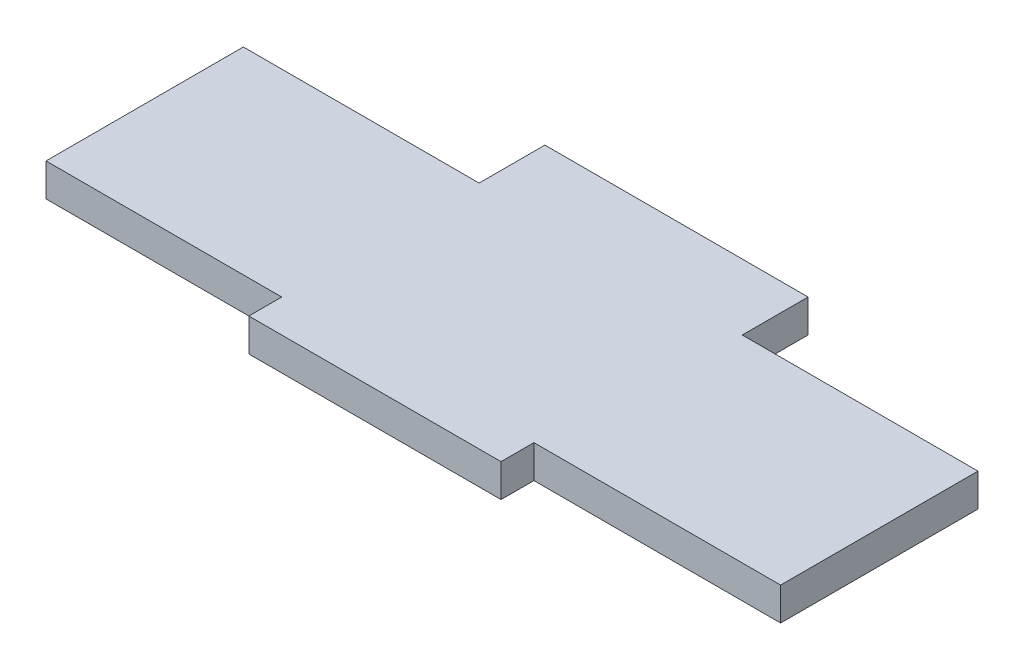
ISO-10303-21;
HEADER;
FILE_DESCRIPTION(('STEP AP214'),'2;1');
FILE_NAME('part.step','',(''),(''),'','','');
FILE_SCHEMA(('AUTOMOTIVE_DESIGN { 1 0 10303 214 1 1 1 1 }'));
ENDSEC;
DATA;
#1=APPLICATION_CONTEXT('core data for automotive mechanical design processes');
#2=APPLICATION_PROTOCOL_DEFINITION('international standard','automotive_design',2000,#1);
#3=PRODUCT_CONTEXT('',#1,'mechanical');
#4=PRODUCT('Part','Part','',(#3));
#5=PRODUCT_RELATED_PRODUCT_CATEGORY('part','',(#4));
#6=PRODUCT_DEFINITION_FORMATION('','',#4);
#7=PRODUCT_DEFINITION_CONTEXT('part definition',#1,'design');
#8=PRODUCT_DEFINITION('design','',#6,#7);
#9=PRODUCT_DEFINITION_SHAPE('','',#8);
#10=(LENGTH_UNIT() NAMED_UNIT(*) SI_UNIT(.MILLI.,.METRE.));
#11=(NAMED_UNIT(*) PLANE_ANGLE_UNIT() SI_UNIT($,.RADIAN.));
#12=(NAMED_UNIT(*) SI_UNIT($,.STERADIAN.) SOLID_ANGLE_UNIT());
#13=UNCERTAINTY_MEASURE_WITH_UNIT(LENGTH_MEASURE(1.E-05),#10,'distance_accuracy_value','');
#14=(GEOMETRIC_REPRESENTATION_CONTEXT(3) GLOBAL_UNCERTAINTY_ASSIGNED_CONTEXT((#13)) GLOBAL_UNIT_ASSIGNED_CONTEXT((#10,
#11,#12)) REPRESENTATION_CONTEXT('',''));
#15=CARTESIAN_POINT('',(0.,0.,0.));
#16=DIRECTION('',(0.,0.,1.));
#17=DIRECTION('',(1.,0.,0.));
#18=AXIS2_PLACEMENT_3D('',#15,#16,#17);
#19=CARTESIAN_POINT('',(-22.4972309435807,3.,0.));
#20=DIRECTION('',(1.,0.,0.));
#21=DIRECTION('',(0.,0.,-1.));
#22=AXIS2_PLACEMENT_3D('',#19,#20,#21);
#23=PLANE('',#22);
#24=DIRECTION('',(0.,0.,1.));
#25=VECTOR('',#24,1.);
#26=CARTESIAN_POINT('',(-22.4972309435807,0.,0.));
#27=LINE('',#26,#25);
#28=CARTESIAN_POINT('',(-22.4972309435807,0.,0.));
#29=VERTEX_POINT('',#28);
#30=CARTESIAN_POINT('',(-22.4972309435807,0.,3.));
#31=VERTEX_POINT('',#30);
#32=EDGE_CURVE('E155',#29,#31,#27,.T.);
#33=ORIENTED_EDGE('',*,*,#32,.F.);
#34=DIRECTION('',(0.,-1.,0.));
#35=VECTOR('',#34,1.);
#36=CARTESIAN_POINT('',(-22.4972309435807,3.,0.));
#37=LINE('',#36,#35);
#38=CARTESIAN_POINT('',(-22.4972309435807,3.,0.));
#39=VERTEX_POINT('',#38);
#40=EDGE_CURVE('E11',#39,#29,#37,.T.);
#41=ORIENTED_EDGE('',*,*,#40,.F.);
#42=DIRECTION('',(0.,0.,1.));
#43=VECTOR('',#42,1.);
#44=CARTESIAN_POINT('',(-22.4972309435807,3.,0.));
#45=LINE('',#44,#43);
#46=CARTESIAN_POINT('',(-22.4972309435807,3.,3.));
#47=VERTEX_POINT('',#46);
#48=EDGE_CURVE('E182',#39,#47,#45,.T.);
#49=ORIENTED_EDGE('',*,*,#48,.T.);
#50=DIRECTION('',(0.,-1.,0.));
#51=VECTOR('',#50,1.);
#52=CARTESIAN_POINT('',(-22.4972309435807,3.,3.));
#53=LINE('',#52,#51);
#54=EDGE_CURVE('E98',#47,#31,#53,.T.);
#55=ORIENTED_EDGE('',*,*,#54,.T.);
#56=EDGE_LOOP('',(#33,#41,#49,#55));
#57=FACE_BOUND('',#56,.T.);
#58=ADVANCED_FACE('F35',(#57),#23,.T.);
#59=CARTESIAN_POINT('',(0.,3.,0.));
#60=DIRECTION('',(0.,0.,-1.));
#61=DIRECTION('',(-1.,0.,0.));
#62=AXIS2_PLACEMENT_3D('',#59,#60,#61);
#63=PLANE('',#62);
#64=DIRECTION('',(1.,0.,0.));
#65=VECTOR('',#64,1.);
#66=CARTESIAN_POINT('',(0.,0.,0.));
#67=LINE('',#66,#65);
#68=CARTESIAN_POINT('',(0.,0.,0.));
#69=VERTEX_POINT('',#68);
#70=EDGE_CURVE('E158',#29,#69,#67,.T.);
#71=ORIENTED_EDGE('',*,*,#70,.T.);
#72=DIRECTION('',(0.,-1.,0.));
#73=VECTOR('',#72,1.);
#74=CARTESIAN_POINT('',(0.,3.,0.));
#75=LINE('',#74,#73);
#76=CARTESIAN_POINT('',(0.,3.,0.));
#77=VERTEX_POINT('',#76);
#78=EDGE_CURVE('E43',#77,#69,#75,.T.);
#79=ORIENTED_EDGE('',*,*,#78,.F.);
#80=DIRECTION('',(1.,0.,0.));
#81=VECTOR('',#80,1.);
#82=CARTESIAN_POINT('',(0.,3.,0.));
#83=LINE('',#82,#81);
#84=EDGE_CURVE('E141',#39,#77,#83,.T.);
#85=ORIENTED_EDGE('',*,*,#84,.F.);
#86=ORIENTED_EDGE('',*,*,#40,.T.);
#87=EDGE_LOOP('',(#71,#79,#85,#86));
#88=FACE_BOUND('',#87,.T.);
#89=ADVANCED_FACE('F206',(#88),#63,.F.);
#90=CARTESIAN_POINT('',(0.,3.,0.));
#91=DIRECTION('',(1.,0.,0.));
#92=DIRECTION('',(0.,0.,-1.));
#93=AXIS2_PLACEMENT_3D('',#90,#91,#92);
#94=PLANE('',#93);
#95=DIRECTION('',(0.,0.,1.));
#96=VECTOR('',#95,1.);
#97=CARTESIAN_POINT('',(0.,0.,0.));
#98=LINE('',#97,#96);
#99=CARTESIAN_POINT('',(0.,0.,-18.));
#100=VERTEX_POINT('',#99);
#101=EDGE_CURVE('E161',#100,#69,#98,.T.);
#102=ORIENTED_EDGE('',*,*,#101,.F.);
#103=DIRECTION('',(0.,-1.,0.));
#104=VECTOR('',#103,1.);
#105=CARTESIAN_POINT('',(0.,3.,-18.));
#106=LINE('',#105,#104);
#107=CARTESIAN_POINT('',(0.,3.,-18.));
#108=VERTEX_POINT('',#107);
#109=EDGE_CURVE('E196',#108,#100,#106,.T.);
#110=ORIENTED_EDGE('',*,*,#109,.F.);
#111=DIRECTION('',(0.,0.,1.));
#112=VECTOR('',#111,1.);
#113=CARTESIAN_POINT('',(0.,3.,0.));
#114=LINE('',#113,#112);
#115=EDGE_CURVE('E203',#108,#77,#114,.T.);
#116=ORIENTED_EDGE('',*,*,#115,.T.);
#117=ORIENTED_EDGE('',*,*,#78,.T.);
#118=EDGE_LOOP('',(#102,#110,#116,#117));
#119=FACE_BOUND('',#118,.T.);
#120=ADVANCED_FACE('F201',(#119),#94,.T.);
#121=CARTESIAN_POINT('',(0.,3.,-18.));
#122=DIRECTION('',(0.,0.,-1.));
#123=DIRECTION('',(-1.,0.,0.));
#124=AXIS2_PLACEMENT_3D('',#121,#122,#123);
#125=PLANE('',#124);
#126=DIRECTION('',(1.,0.,0.));
#127=VECTOR('',#126,1.);
#128=CARTESIAN_POINT('',(0.,0.,-18.));
#129=LINE('',#128,#127);
#130=CARTESIAN_POINT('',(-21.4972309435807,0.,-18.));
#131=VERTEX_POINT('',#130);
#132=EDGE_CURVE('E164',#131,#100,#129,.T.);
#133=ORIENTED_EDGE('',*,*,#132,.F.);
#134=DIRECTION('',(0.,-1.,0.));
#135=VECTOR('',#134,1.);
#136=CARTESIAN_POINT('',(-21.4972309435807,3.,-18.));
#137=LINE('',#136,#135);
#138=CARTESIAN_POINT('',(-21.4972309435807,3.,-18.));
#139=VERTEX_POINT('',#138);
#140=EDGE_CURVE('E194',#139,#131,#137,.T.);
#141=ORIENTED_EDGE('',*,*,#140,.F.);
#142=DIRECTION('',(1.,0.,0.));
#143=VECTOR('',#142,1.);
#144=CARTESIAN_POINT('',(0.,3.,-18.));
#145=LINE('',#144,#143);
#146=EDGE_CURVE('E216',#139,#108,#145,.T.);
#147=ORIENTED_EDGE('',*,*,#146,.T.);
#148=ORIENTED_EDGE('',*,*,#109,.T.);
#149=EDGE_LOOP('',(#133,#141,#147,#148));
#150=FACE_BOUND('',#149,.T.);
#151=ADVANCED_FACE('F212',(#150),#125,.T.);
#152=CARTESIAN_POINT('',(-21.4972309435806,3.,0.));
#153=DIRECTION('',(-1.,0.,0.));
#154=DIRECTION('',(0.,0.,1.));
#155=AXIS2_PLACEMENT_3D('',#152,#153,#154);
#156=PLANE('',#155);
#157=DIRECTION('',(0.,0.,-1.));
#158=VECTOR('',#157,1.);
#159=CARTESIAN_POINT('',(-21.4972309435806,0.,0.));
#160=LINE('',#159,#158);
#161=CARTESIAN_POINT('',(-21.4972309435807,0.,-24.));
#162=VERTEX_POINT('',#161);
#163=EDGE_CURVE('E167',#131,#162,#160,.T.);
#164=ORIENTED_EDGE('',*,*,#163,.T.);
#165=DIRECTION('',(0.,-1.,0.));
#166=VECTOR('',#165,1.);
#167=CARTESIAN_POINT('',(-21.4972309435807,3.,-24.));
#168=LINE('',#167,#166);
#169=CARTESIAN_POINT('',(-21.4972309435807,3.,-24.));
#170=VERTEX_POINT('',#169);
#171=EDGE_CURVE('E192',#170,#162,#168,.T.);
#172=ORIENTED_EDGE('',*,*,#171,.F.);
#173=DIRECTION('',(0.,0.,-1.));
#174=VECTOR('',#173,1.);
#175=CARTESIAN_POINT('',(-21.4972309435806,3.,0.));
#176=LINE('',#175,#174);
#177=EDGE_CURVE('E218',#139,#170,#176,.T.);
#178=ORIENTED_EDGE('',*,*,#177,.F.);
#179=ORIENTED_EDGE('',*,*,#140,.T.);
#180=EDGE_LOOP('',(#164,#172,#178,#179));
#181=FACE_BOUND('',#180,.T.);
#182=ADVANCED_FACE('F325',(#181),#156,.F.);
#183=CARTESIAN_POINT('',(0.,3.,-24.));
#184=DIRECTION('',(0.,0.,-1.));
#185=DIRECTION('',(-1.,0.,0.));
#186=AXIS2_PLACEMENT_3D('',#183,#184,#185);
#187=PLANE('',#186);
#188=DIRECTION('',(1.,0.,0.));
#189=VECTOR('',#188,1.);
#190=CARTESIAN_POINT('',(0.,0.,-24.));
#191=LINE('',#190,#189);
#192=CARTESIAN_POINT('',(-45.4972309435806,0.,-24.));
#193=VERTEX_POINT('',#192);
#194=EDGE_CURVE('E171',#193,#162,#191,.T.);
#195=ORIENTED_EDGE('',*,*,#194,.F.);
#196=DIRECTION('',(0.,-1.,0.));
#197=VECTOR('',#196,1.);
#198=CARTESIAN_POINT('',(-45.4972309435806,3.,-24.));
#199=LINE('',#198,#197);
#200=CARTESIAN_POINT('',(-45.4972309435806,3.,-24.));
#201=VERTEX_POINT('',#200);
#202=EDGE_CURVE('E190',#201,#193,#199,.T.);
#203=ORIENTED_EDGE('',*,*,#202,.F.);
#204=DIRECTION('',(1.,0.,0.));
#205=VECTOR('',#204,1.);
#206=CARTESIAN_POINT('',(0.,3.,-24.));
#207=LINE('',#206,#205);
#208=EDGE_CURVE('E224',#201,#170,#207,.T.);
#209=ORIENTED_EDGE('',*,*,#208,.T.);
#210=ORIENTED_EDGE('',*,*,#171,.T.);
#211=EDGE_LOOP('',(#195,#203,#209,#210));
#212=FACE_BOUND('',#211,.T.);
#213=ADVANCED_FACE('F239',(#212),#187,.T.);
#214=CARTESIAN_POINT('',(-45.4972309435806,3.,0.));
#215=DIRECTION('',(-1.,0.,0.));
#216=DIRECTION('',(0.,0.,1.));
#217=AXIS2_PLACEMENT_3D('',#214,#215,#216);
#218=PLANE('',#217);
#219=DIRECTION('',(0.,0.,-1.));
#220=VECTOR('',#219,1.);
#221=CARTESIAN_POINT('',(-45.4972309435806,0.,0.));
#222=LINE('',#221,#220);
#223=CARTESIAN_POINT('',(-45.4972309435806,0.,-18.));
#224=VERTEX_POINT('',#223);
#225=EDGE_CURVE('E174',#224,#193,#222,.T.);
#226=ORIENTED_EDGE('',*,*,#225,.F.);
#227=DIRECTION('',(0.,-1.,0.));
#228=VECTOR('',#227,1.);
#229=CARTESIAN_POINT('',(-45.4972309435806,3.,-18.));
#230=LINE('',#229,#228);
#231=CARTESIAN_POINT('',(-45.4972309435806,3.,-18.));
#232=VERTEX_POINT('',#231);
#233=EDGE_CURVE('E188',#232,#224,#230,.T.);
#234=ORIENTED_EDGE('',*,*,#233,.F.);
#235=DIRECTION('',(0.,0.,-1.));
#236=VECTOR('',#235,1.);
#237=CARTESIAN_POINT('',(-45.4972309435806,3.,0.));
#238=LINE('',#237,#236);
#239=EDGE_CURVE('E226',#232,#201,#238,.T.);
#240=ORIENTED_EDGE('',*,*,#239,.T.);
#241=ORIENTED_EDGE('',*,*,#202,.T.);
#242=EDGE_LOOP('',(#226,#234,#240,#241));
#243=FACE_BOUND('',#242,.T.);
#244=ADVANCED_FACE('F240',(#243),#218,.T.);
#245=CARTESIAN_POINT('',(-66.9944618871613,0.,-18.));
#246=VERTEX_POINT('',#245);
#247=EDGE_CURVE('E168',#246,#224,#129,.T.);
#248=ORIENTED_EDGE('',*,*,#247,.F.);
#249=DIRECTION('',(0.,-1.,0.));
#250=VECTOR('',#249,1.);
#251=CARTESIAN_POINT('',(-66.9944618871613,3.,-18.));
#252=LINE('',#251,#250);
#253=CARTESIAN_POINT('',(-66.9944618871613,3.,-18.));
#254=VERTEX_POINT('',#253);
#255=EDGE_CURVE('E186',#254,#246,#252,.T.);
#256=ORIENTED_EDGE('',*,*,#255,.F.);
#257=EDGE_CURVE('E220',#254,#232,#145,.T.);
#258=ORIENTED_EDGE('',*,*,#257,.T.);
#259=ORIENTED_EDGE('',*,*,#233,.T.);
#260=EDGE_LOOP('',(#248,#256,#258,#259));
#261=FACE_BOUND('',#260,.T.);
#262=ADVANCED_FACE('F233',(#261),#125,.T.);
#263=CARTESIAN_POINT('',(-66.9944618871613,3.,0.));
#264=DIRECTION('',(1.,0.,0.));
#265=DIRECTION('',(0.,0.,-1.));
#266=AXIS2_PLACEMENT_3D('',#263,#264,#265);
#267=PLANE('',#266);
#268=DIRECTION('',(0.,0.,1.));
#269=VECTOR('',#268,1.);
#270=CARTESIAN_POINT('',(-66.9944618871613,0.,0.));
#271=LINE('',#270,#269);
#272=CARTESIAN_POINT('',(-66.9944618871613,0.,0.));
#273=VERTEX_POINT('',#272);
#274=EDGE_CURVE('E177',#246,#273,#271,.T.);
#275=ORIENTED_EDGE('',*,*,#274,.T.);
#276=DIRECTION('',(0.,-1.,0.));
#277=VECTOR('',#276,1.);
#278=CARTESIAN_POINT('',(-66.9944618871613,3.,0.));
#279=LINE('',#278,#277);
#280=CARTESIAN_POINT('',(-66.9944618871613,3.,0.));
#281=VERTEX_POINT('',#280);
#282=EDGE_CURVE('E146',#281,#273,#279,.T.);
#283=ORIENTED_EDGE('',*,*,#282,.F.);
#284=DIRECTION('',(0.,0.,1.));
#285=VECTOR('',#284,1.);
#286=CARTESIAN_POINT('',(-66.9944618871613,3.,0.));
#287=LINE('',#286,#285);
#288=EDGE_CURVE('E136',#254,#281,#287,.T.);
#289=ORIENTED_EDGE('',*,*,#288,.F.);
#290=ORIENTED_EDGE('',*,*,#255,.T.);
#291=EDGE_LOOP('',(#275,#283,#289,#290));
#292=FACE_BOUND('',#291,.T.);
#293=ADVANCED_FACE('F244',(#292),#267,.F.);
#294=CARTESIAN_POINT('',(-45.4972309435806,0.,0.));
#295=VERTEX_POINT('',#294);
#296=EDGE_CURVE('E145',#273,#295,#67,.T.);
#297=ORIENTED_EDGE('',*,*,#296,.T.);
#298=DIRECTION('',(0.,-1.,0.));
#299=VECTOR('',#298,1.);
#300=CARTESIAN_POINT('',(-45.4972309435806,3.,0.));
#301=LINE('',#300,#299);
#302=CARTESIAN_POINT('',(-45.4972309435806,3.,0.));
#303=VERTEX_POINT('',#302);
#304=EDGE_CURVE('E142',#303,#295,#301,.T.);
#305=ORIENTED_EDGE('',*,*,#304,.F.);
#306=EDGE_CURVE('E129',#281,#303,#83,.T.);
#307=ORIENTED_EDGE('',*,*,#306,.F.);
#308=ORIENTED_EDGE('',*,*,#282,.T.);
#309=EDGE_LOOP('',(#297,#305,#307,#308));
#310=FACE_BOUND('',#309,.T.);
#311=ADVANCED_FACE('F143',(#310),#63,.F.);
#312=CARTESIAN_POINT('',(-45.4972309435806,3.,0.));
#313=DIRECTION('',(1.,0.,0.));
#314=DIRECTION('',(0.,0.,-1.));
#315=AXIS2_PLACEMENT_3D('',#312,#313,#314);
#316=PLANE('',#315);
#317=DIRECTION('',(0.,0.,1.));
#318=VECTOR('',#317,1.);
#319=CARTESIAN_POINT('',(-45.4972309435806,0.,0.));
#320=LINE('',#319,#318);
#321=CARTESIAN_POINT('',(-45.4972309435806,0.,3.));
#322=VERTEX_POINT('',#321);
#323=EDGE_CURVE('E91',#295,#322,#320,.T.);
#324=ORIENTED_EDGE('',*,*,#323,.T.);
#325=DIRECTION('',(0.,-1.,0.));
#326=VECTOR('',#325,1.);
#327=CARTESIAN_POINT('',(-45.4972309435806,3.,3.));
#328=LINE('',#327,#326);
#329=CARTESIAN_POINT('',(-45.4972309435806,3.,3.));
#330=VERTEX_POINT('',#329);
#331=EDGE_CURVE('E147',#330,#322,#328,.T.);
#332=ORIENTED_EDGE('',*,*,#331,.F.);
#333=DIRECTION('',(0.,0.,1.));
#334=VECTOR('',#333,1.);
#335=CARTESIAN_POINT('',(-45.4972309435806,3.,0.));
#336=LINE('',#335,#334);
#337=EDGE_CURVE('E133',#303,#330,#336,.T.);
#338=ORIENTED_EDGE('',*,*,#337,.F.);
#339=ORIENTED_EDGE('',*,*,#304,.T.);
#340=EDGE_LOOP('',(#324,#332,#338,#339));
#341=FACE_BOUND('',#340,.T.);
#342=ADVANCED_FACE('F149',(#341),#316,.F.);
#343=CARTESIAN_POINT('',(0.,3.,3.));
#344=DIRECTION('',(0.,0.,-1.));
#345=DIRECTION('',(-1.,0.,0.));
#346=AXIS2_PLACEMENT_3D('',#343,#344,#345);
#347=PLANE('',#346);
#348=DIRECTION('',(1.,0.,0.));
#349=VECTOR('',#348,1.);
#350=CARTESIAN_POINT('',(0.,0.,3.));
#351=LINE('',#350,#349);
#352=EDGE_CURVE('E180',#322,#31,#351,.T.);
#353=ORIENTED_EDGE('',*,*,#352,.T.);
#354=ORIENTED_EDGE('',*,*,#54,.F.);
#355=DIRECTION('',(1.,0.,0.));
#356=VECTOR('',#355,1.);
#357=CARTESIAN_POINT('',(0.,3.,3.));
#358=LINE('',#357,#356);
#359=EDGE_CURVE('E51',#330,#47,#358,.T.);
#360=ORIENTED_EDGE('',*,*,#359,.F.);
#361=ORIENTED_EDGE('',*,*,#331,.T.);
#362=EDGE_LOOP('',(#353,#354,#360,#361));
#363=FACE_BOUND('',#362,.T.);
#364=ADVANCED_FACE('F259',(#363),#347,.F.);
#365=CARTESIAN_POINT('',(0.,3.,0.));
#366=DIRECTION('',(0.,1.,0.));
#367=DIRECTION('',(0.,0.,1.));
#368=AXIS2_PLACEMENT_3D('',#365,#366,#367);
#369=PLANE('',#368);
#370=ORIENTED_EDGE('',*,*,#48,.F.);
#371=ORIENTED_EDGE('',*,*,#84,.T.);
#372=ORIENTED_EDGE('',*,*,#115,.F.);
#373=ORIENTED_EDGE('',*,*,#146,.F.);
#374=ORIENTED_EDGE('',*,*,#177,.T.);
#375=ORIENTED_EDGE('',*,*,#208,.F.);
#376=ORIENTED_EDGE('',*,*,#239,.F.);
#377=ORIENTED_EDGE('',*,*,#257,.F.);
#378=ORIENTED_EDGE('',*,*,#288,.T.);
#379=ORIENTED_EDGE('',*,*,#306,.T.);
#380=ORIENTED_EDGE('',*,*,#337,.T.);
#381=ORIENTED_EDGE('',*,*,#359,.T.);
#382=EDGE_LOOP('',(#370,#371,#372,#373,#374,#375,#376,#377,#378,#379,#380,#381));
#383=FACE_BOUND('',#382,.T.);
#384=ADVANCED_FACE('F131',(#383),#369,.T.);
#385=CARTESIAN_POINT('',(0.,0.,0.));
#386=DIRECTION('',(0.,1.,0.));
#387=DIRECTION('',(0.,0.,1.));
#388=AXIS2_PLACEMENT_3D('',#385,#386,#387);
#389=PLANE('',#388);
#390=ORIENTED_EDGE('',*,*,#32,.T.);
#391=ORIENTED_EDGE('',*,*,#352,.F.);
#392=ORIENTED_EDGE('',*,*,#323,.F.);
#393=ORIENTED_EDGE('',*,*,#296,.F.);
#394=ORIENTED_EDGE('',*,*,#274,.F.);
#395=ORIENTED_EDGE('',*,*,#247,.T.);
#396=ORIENTED_EDGE('',*,*,#225,.T.);
#397=ORIENTED_EDGE('',*,*,#194,.T.);
#398=ORIENTED_EDGE('',*,*,#163,.F.);
#399=ORIENTED_EDGE('',*,*,#132,.T.);
#400=ORIENTED_EDGE('',*,*,#101,.T.);
#401=ORIENTED_EDGE('',*,*,#70,.F.);
#402=EDGE_LOOP('',(#390,#391,#392,#393,#394,#395,#396,#397,#398,#399,#400,#401));
#403=FACE_BOUND('',#402,.T.);
#404=ADVANCED_FACE('F208',(#403),#389,.F.);
#405=CLOSED_SHELL('',(#58,#89,#120,#151,#182,#213,#244,#262,#293,#311,#342,#364,#384,#404));
#406=MANIFOLD_SOLID_BREP('B2',#405);
#407=ADVANCED_BREP_SHAPE_REPRESENTATION('',(#18,#406),#14);
#408=SHAPE_DEFINITION_REPRESENTATION(#9,#407);
ENDSEC;
END-ISO-10303-21;
